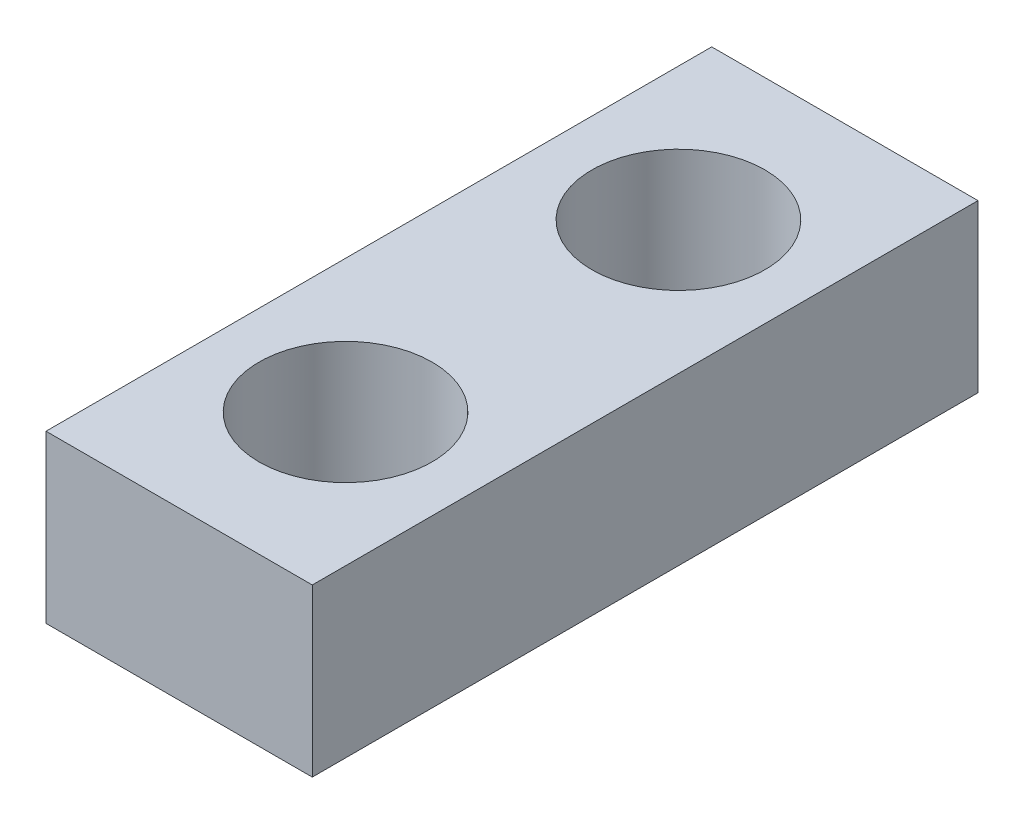
ISO-10303-21;
HEADER;
FILE_DESCRIPTION(('STEP AP214'),'2;1');
FILE_NAME('part.step','',(''),(''),'','','');
FILE_SCHEMA(('AUTOMOTIVE_DESIGN { 1 0 10303 214 1 1 1 1 }'));
ENDSEC;
DATA;
#1=APPLICATION_CONTEXT('core data for automotive mechanical design processes');
#2=APPLICATION_PROTOCOL_DEFINITION('international standard','automotive_design',2000,#1);
#3=PRODUCT_CONTEXT('',#1,'mechanical');
#4=PRODUCT('Part','Part','',(#3));
#5=PRODUCT_RELATED_PRODUCT_CATEGORY('part','',(#4));
#6=PRODUCT_DEFINITION_FORMATION('','',#4);
#7=PRODUCT_DEFINITION_CONTEXT('part definition',#1,'design');
#8=PRODUCT_DEFINITION('design','',#6,#7);
#9=PRODUCT_DEFINITION_SHAPE('','',#8);
#10=(LENGTH_UNIT() NAMED_UNIT(*) SI_UNIT(.MILLI.,.METRE.));
#11=(NAMED_UNIT(*) PLANE_ANGLE_UNIT() SI_UNIT($,.RADIAN.));
#12=(NAMED_UNIT(*) SI_UNIT($,.STERADIAN.) SOLID_ANGLE_UNIT());
#13=UNCERTAINTY_MEASURE_WITH_UNIT(LENGTH_MEASURE(1.E-05),#10,'distance_accuracy_value','');
#14=(GEOMETRIC_REPRESENTATION_CONTEXT(3) GLOBAL_UNCERTAINTY_ASSIGNED_CONTEXT((#13)) GLOBAL_UNIT_ASSIGNED_CONTEXT((#10,
#11,#12)) REPRESENTATION_CONTEXT('',''));
#15=CARTESIAN_POINT('',(0.,0.,0.));
#16=DIRECTION('',(0.,0.,1.));
#17=DIRECTION('',(1.,0.,0.));
#18=AXIS2_PLACEMENT_3D('',#15,#16,#17);
#19=CARTESIAN_POINT('',(0.,6.35,0.));
#20=DIRECTION('',(0.,-1.,0.));
#21=DIRECTION('',(0.,0.,-1.));
#22=AXIS2_PLACEMENT_3D('',#19,#20,#21);
#23=PLANE('',#22);
#24=DIRECTION('',(0.,0.,1.));
#25=VECTOR('',#24,1.);
#26=CARTESIAN_POINT('',(0.,6.35,0.));
#27=LINE('',#26,#25);
#28=CARTESIAN_POINT('',(0.,6.35,-25.4));
#29=VERTEX_POINT('',#28);
#30=CARTESIAN_POINT('',(0.,6.35,0.));
#31=VERTEX_POINT('',#30);
#32=EDGE_CURVE('E98',#29,#31,#27,.T.);
#33=ORIENTED_EDGE('',*,*,#32,.T.);
#34=DIRECTION('',(1.,0.,0.));
#35=VECTOR('',#34,1.);
#36=CARTESIAN_POINT('',(0.,6.35,0.));
#37=LINE('',#36,#35);
#38=CARTESIAN_POINT('',(10.16,6.35,0.));
#39=VERTEX_POINT('',#38);
#40=EDGE_CURVE('E93',#31,#39,#37,.T.);
#41=ORIENTED_EDGE('',*,*,#40,.T.);
#42=DIRECTION('',(0.,0.,-1.));
#43=VECTOR('',#42,1.);
#44=CARTESIAN_POINT('',(10.16,6.35,0.));
#45=LINE('',#44,#43);
#46=CARTESIAN_POINT('',(10.16,6.35,-25.4));
#47=VERTEX_POINT('',#46);
#48=EDGE_CURVE('E96',#39,#47,#45,.T.);
#49=ORIENTED_EDGE('',*,*,#48,.T.);
#50=DIRECTION('',(-1.,0.,0.));
#51=VECTOR('',#50,1.);
#52=CARTESIAN_POINT('',(0.,6.35,-25.4));
#53=LINE('',#52,#51);
#54=EDGE_CURVE('E63',#47,#29,#53,.T.);
#55=ORIENTED_EDGE('',*,*,#54,.T.);
#56=EDGE_LOOP('',(#33,#41,#49,#55));
#57=FACE_BOUND('',#56,.T.);
#58=CARTESIAN_POINT('',(5.08,6.35,-6.35));
#59=DIRECTION('',(0.,1.,0.));
#60=DIRECTION('',(0.,0.,1.));
#61=AXIS2_PLACEMENT_3D('',#58,#59,#60);
#62=CIRCLE('',#61,3.302);
#63=CARTESIAN_POINT('',(5.08,6.35,-3.048));
#64=VERTEX_POINT('',#63);
#65=EDGE_CURVE('E118',#64,#64,#62,.T.);
#66=ORIENTED_EDGE('',*,*,#65,.F.);
#67=EDGE_LOOP('',(#66));
#68=FACE_BOUND('',#67,.T.);
#69=CARTESIAN_POINT('',(5.08,6.35,-19.05));
#70=DIRECTION('',(0.,1.,0.));
#71=DIRECTION('',(0.,0.,1.));
#72=AXIS2_PLACEMENT_3D('',#69,#70,#71);
#73=CIRCLE('',#72,3.302);
#74=CARTESIAN_POINT('',(5.08,6.35,-15.748));
#75=VERTEX_POINT('',#74);
#76=EDGE_CURVE('E140',#75,#75,#73,.T.);
#77=ORIENTED_EDGE('',*,*,#76,.F.);
#78=EDGE_LOOP('',(#77));
#79=FACE_BOUND('',#78,.T.);
#80=ADVANCED_FACE('F45',(#57,#68,#79),#23,.F.);
#81=CARTESIAN_POINT('',(0.,0.,0.));
#82=DIRECTION('',(0.,-1.,0.));
#83=DIRECTION('',(0.,0.,-1.));
#84=AXIS2_PLACEMENT_3D('',#81,#82,#83);
#85=PLANE('',#84);
#86=CARTESIAN_POINT('',(5.08,0.,-6.35));
#87=DIRECTION('',(0.,1.,0.));
#88=DIRECTION('',(0.,0.,1.));
#89=AXIS2_PLACEMENT_3D('',#86,#87,#88);
#90=CIRCLE('',#89,3.302);
#91=CARTESIAN_POINT('',(5.08,0.,-3.048));
#92=VERTEX_POINT('',#91);
#93=EDGE_CURVE('E136',#92,#92,#90,.T.);
#94=ORIENTED_EDGE('',*,*,#93,.T.);
#95=EDGE_LOOP('',(#94));
#96=FACE_BOUND('',#95,.T.);
#97=DIRECTION('',(0.,0.,1.));
#98=VECTOR('',#97,1.);
#99=CARTESIAN_POINT('',(0.,0.,0.));
#100=LINE('',#99,#98);
#101=CARTESIAN_POINT('',(0.,0.,-25.4));
#102=VERTEX_POINT('',#101);
#103=CARTESIAN_POINT('',(0.,0.,0.));
#104=VERTEX_POINT('',#103);
#105=EDGE_CURVE('E114',#102,#104,#100,.T.);
#106=ORIENTED_EDGE('',*,*,#105,.F.);
#107=DIRECTION('',(-1.,0.,0.));
#108=VECTOR('',#107,1.);
#109=CARTESIAN_POINT('',(0.,0.,-25.4));
#110=LINE('',#109,#108);
#111=CARTESIAN_POINT('',(10.16,0.,-25.4));
#112=VERTEX_POINT('',#111);
#113=EDGE_CURVE('E86',#112,#102,#110,.T.);
#114=ORIENTED_EDGE('',*,*,#113,.F.);
#115=DIRECTION('',(0.,0.,-1.));
#116=VECTOR('',#115,1.);
#117=CARTESIAN_POINT('',(10.16,0.,0.));
#118=LINE('',#117,#116);
#119=CARTESIAN_POINT('',(10.16,0.,0.));
#120=VERTEX_POINT('',#119);
#121=EDGE_CURVE('E80',#120,#112,#118,.T.);
#122=ORIENTED_EDGE('',*,*,#121,.F.);
#123=DIRECTION('',(1.,0.,0.));
#124=VECTOR('',#123,1.);
#125=CARTESIAN_POINT('',(0.,0.,0.));
#126=LINE('',#125,#124);
#127=EDGE_CURVE('E103',#104,#120,#126,.T.);
#128=ORIENTED_EDGE('',*,*,#127,.F.);
#129=EDGE_LOOP('',(#106,#114,#122,#128));
#130=FACE_BOUND('',#129,.T.);
#131=CARTESIAN_POINT('',(5.08,0.,-19.05));
#132=DIRECTION('',(0.,1.,0.));
#133=DIRECTION('',(0.,0.,1.));
#134=AXIS2_PLACEMENT_3D('',#131,#132,#133);
#135=CIRCLE('',#134,3.302);
#136=CARTESIAN_POINT('',(5.08,0.,-15.748));
#137=VERTEX_POINT('',#136);
#138=EDGE_CURVE('E144',#137,#137,#135,.T.);
#139=ORIENTED_EDGE('',*,*,#138,.T.);
#140=EDGE_LOOP('',(#139));
#141=FACE_BOUND('',#140,.T.);
#142=ADVANCED_FACE('F131',(#96,#130,#141),#85,.T.);
#143=CARTESIAN_POINT('',(0.,6.35,0.));
#144=DIRECTION('',(1.,0.,0.));
#145=DIRECTION('',(0.,0.,-1.));
#146=AXIS2_PLACEMENT_3D('',#143,#144,#145);
#147=PLANE('',#146);
#148=ORIENTED_EDGE('',*,*,#105,.T.);
#149=DIRECTION('',(0.,-1.,0.));
#150=VECTOR('',#149,1.);
#151=CARTESIAN_POINT('',(0.,6.35,0.));
#152=LINE('',#151,#150);
#153=EDGE_CURVE('E11',#31,#104,#152,.T.);
#154=ORIENTED_EDGE('',*,*,#153,.F.);
#155=ORIENTED_EDGE('',*,*,#32,.F.);
#156=DIRECTION('',(0.,-1.,0.));
#157=VECTOR('',#156,1.);
#158=CARTESIAN_POINT('',(0.,6.35,-25.4));
#159=LINE('',#158,#157);
#160=EDGE_CURVE('E110',#29,#102,#159,.T.);
#161=ORIENTED_EDGE('',*,*,#160,.T.);
#162=EDGE_LOOP('',(#148,#154,#155,#161));
#163=FACE_BOUND('',#162,.T.);
#164=ADVANCED_FACE('F47',(#163),#147,.F.);
#165=CARTESIAN_POINT('',(0.,6.35,0.));
#166=DIRECTION('',(0.,0.,-1.));
#167=DIRECTION('',(-1.,0.,0.));
#168=AXIS2_PLACEMENT_3D('',#165,#166,#167);
#169=PLANE('',#168);
#170=ORIENTED_EDGE('',*,*,#127,.T.);
#171=DIRECTION('',(0.,-1.,0.));
#172=VECTOR('',#171,1.);
#173=CARTESIAN_POINT('',(10.16,6.35,0.));
#174=LINE('',#173,#172);
#175=EDGE_CURVE('E55',#39,#120,#174,.T.);
#176=ORIENTED_EDGE('',*,*,#175,.F.);
#177=ORIENTED_EDGE('',*,*,#40,.F.);
#178=ORIENTED_EDGE('',*,*,#153,.T.);
#179=EDGE_LOOP('',(#170,#176,#177,#178));
#180=FACE_BOUND('',#179,.T.);
#181=ADVANCED_FACE('F102',(#180),#169,.F.);
#182=CARTESIAN_POINT('',(10.16,6.35,0.));
#183=DIRECTION('',(-1.,0.,0.));
#184=DIRECTION('',(0.,0.,1.));
#185=AXIS2_PLACEMENT_3D('',#182,#183,#184);
#186=PLANE('',#185);
#187=ORIENTED_EDGE('',*,*,#121,.T.);
#188=DIRECTION('',(0.,-1.,0.));
#189=VECTOR('',#188,1.);
#190=CARTESIAN_POINT('',(10.16,6.35,-25.4));
#191=LINE('',#190,#189);
#192=EDGE_CURVE('E105',#47,#112,#191,.T.);
#193=ORIENTED_EDGE('',*,*,#192,.F.);
#194=ORIENTED_EDGE('',*,*,#48,.F.);
#195=ORIENTED_EDGE('',*,*,#175,.T.);
#196=EDGE_LOOP('',(#187,#193,#194,#195));
#197=FACE_BOUND('',#196,.T.);
#198=ADVANCED_FACE('F106',(#197),#186,.F.);
#199=CARTESIAN_POINT('',(0.,6.35,-25.4));
#200=DIRECTION('',(0.,0.,1.));
#201=DIRECTION('',(1.,0.,0.));
#202=AXIS2_PLACEMENT_3D('',#199,#200,#201);
#203=PLANE('',#202);
#204=ORIENTED_EDGE('',*,*,#113,.T.);
#205=ORIENTED_EDGE('',*,*,#160,.F.);
#206=ORIENTED_EDGE('',*,*,#54,.F.);
#207=ORIENTED_EDGE('',*,*,#192,.T.);
#208=EDGE_LOOP('',(#204,#205,#206,#207));
#209=FACE_BOUND('',#208,.T.);
#210=ADVANCED_FACE('F128',(#209),#203,.F.);
#211=CARTESIAN_POINT('',(5.08,6.35,-6.35));
#212=DIRECTION('',(0.,-1.,0.));
#213=DIRECTION('',(0.,0.,-1.));
#214=AXIS2_PLACEMENT_3D('',#211,#212,#213);
#215=CYLINDRICAL_SURFACE('',#214,3.302);
#216=ORIENTED_EDGE('',*,*,#65,.T.);
#217=EDGE_LOOP('',(#216));
#218=FACE_BOUND('',#217,.T.);
#219=ORIENTED_EDGE('',*,*,#93,.F.);
#220=EDGE_LOOP('',(#219));
#221=FACE_BOUND('',#220,.T.);
#222=ADVANCED_FACE('F163',(#218,#221),#215,.F.);
#223=CARTESIAN_POINT('',(5.08,6.35,-19.05));
#224=DIRECTION('',(0.,-1.,0.));
#225=DIRECTION('',(0.,0.,-1.));
#226=AXIS2_PLACEMENT_3D('',#223,#224,#225);
#227=CYLINDRICAL_SURFACE('',#226,3.302);
#228=ORIENTED_EDGE('',*,*,#76,.T.);
#229=EDGE_LOOP('',(#228));
#230=FACE_BOUND('',#229,.T.);
#231=ORIENTED_EDGE('',*,*,#138,.F.);
#232=EDGE_LOOP('',(#231));
#233=FACE_BOUND('',#232,.T.);
#234=ADVANCED_FACE('F152',(#230,#233),#227,.F.);
#235=CLOSED_SHELL('',(#80,#142,#164,#181,#198,#210,#222,#234));
#236=MANIFOLD_SOLID_BREP('B2',#235);
#237=ADVANCED_BREP_SHAPE_REPRESENTATION('',(#18,#236),#14);
#238=SHAPE_DEFINITION_REPRESENTATION(#9,#237);
ENDSEC;
END-ISO-10303-21;
